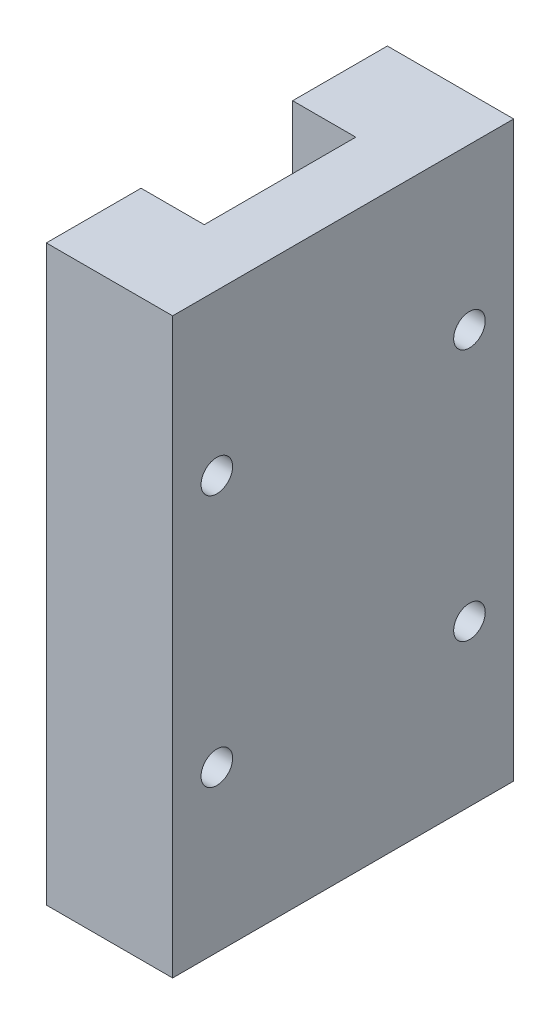
ISO-10303-21;
HEADER;
FILE_DESCRIPTION(('STEP AP214'),'2;1');
FILE_NAME('part.step','',(''),(''),'','','');
FILE_SCHEMA(('AUTOMOTIVE_DESIGN { 1 0 10303 214 1 1 1 1 }'));
ENDSEC;
DATA;
#1=APPLICATION_CONTEXT('core data for automotive mechanical design processes');
#2=APPLICATION_PROTOCOL_DEFINITION('international standard','automotive_design',2000,#1);
#3=PRODUCT_CONTEXT('',#1,'mechanical');
#4=PRODUCT('Part','Part','',(#3));
#5=PRODUCT_RELATED_PRODUCT_CATEGORY('part','',(#4));
#6=PRODUCT_DEFINITION_FORMATION('','',#4);
#7=PRODUCT_DEFINITION_CONTEXT('part definition',#1,'design');
#8=PRODUCT_DEFINITION('design','',#6,#7);
#9=PRODUCT_DEFINITION_SHAPE('','',#8);
#10=(LENGTH_UNIT() NAMED_UNIT(*) SI_UNIT(.MILLI.,.METRE.));
#11=(NAMED_UNIT(*) PLANE_ANGLE_UNIT() SI_UNIT($,.RADIAN.));
#12=(NAMED_UNIT(*) SI_UNIT($,.STERADIAN.) SOLID_ANGLE_UNIT());
#13=UNCERTAINTY_MEASURE_WITH_UNIT(LENGTH_MEASURE(1.E-05),#10,'distance_accuracy_value','');
#14=(GEOMETRIC_REPRESENTATION_CONTEXT(3) GLOBAL_UNCERTAINTY_ASSIGNED_CONTEXT((#13)) GLOBAL_UNIT_ASSIGNED_CONTEXT((#10,
#11,#12)) REPRESENTATION_CONTEXT('',''));
#15=CARTESIAN_POINT('',(0.,0.,0.));
#16=DIRECTION('',(0.,0.,1.));
#17=DIRECTION('',(1.,0.,0.));
#18=AXIS2_PLACEMENT_3D('',#15,#16,#17);
#19=CARTESIAN_POINT('',(0.,22.7,13.5));
#20=DIRECTION('',(-1.,0.,0.));
#21=DIRECTION('',(0.,0.,1.));
#22=AXIS2_PLACEMENT_3D('',#19,#20,#21);
#23=PLANE('',#22);
#24=DIRECTION('',(0.,-1.,0.));
#25=VECTOR('',#24,1.);
#26=CARTESIAN_POINT('',(0.,22.7,6.));
#27=LINE('',#26,#25);
#28=CARTESIAN_POINT('',(0.,22.7,6.));
#29=VERTEX_POINT('',#28);
#30=CARTESIAN_POINT('',(0.,-22.7,6.));
#31=VERTEX_POINT('',#30);
#32=EDGE_CURVE('E164',#29,#31,#27,.T.);
#33=ORIENTED_EDGE('',*,*,#32,.T.);
#34=DIRECTION('',(0.,0.,-1.));
#35=VECTOR('',#34,1.);
#36=CARTESIAN_POINT('',(0.,-22.7,13.5));
#37=LINE('',#36,#35);
#38=CARTESIAN_POINT('',(0.,-22.7,13.5));
#39=VERTEX_POINT('',#38);
#40=EDGE_CURVE('E184',#39,#31,#37,.T.);
#41=ORIENTED_EDGE('',*,*,#40,.F.);
#42=DIRECTION('',(0.,-1.,0.));
#43=VECTOR('',#42,1.);
#44=CARTESIAN_POINT('',(0.,-22.7,13.5));
#45=LINE('',#44,#43);
#46=CARTESIAN_POINT('',(0.,22.7,13.5));
#47=VERTEX_POINT('',#46);
#48=EDGE_CURVE('E167',#47,#39,#45,.T.);
#49=ORIENTED_EDGE('',*,*,#48,.F.);
#50=DIRECTION('',(0.,0.,1.));
#51=VECTOR('',#50,1.);
#52=CARTESIAN_POINT('',(0.,22.7,13.5));
#53=LINE('',#52,#51);
#54=EDGE_CURVE('E78',#29,#47,#53,.T.);
#55=ORIENTED_EDGE('',*,*,#54,.F.);
#56=EDGE_LOOP('',(#33,#41,#49,#55));
#57=FACE_BOUND('',#56,.T.);
#58=ADVANCED_FACE('F33',(#57),#23,.T.);
#59=CARTESIAN_POINT('',(10.,-22.7,13.5));
#60=DIRECTION('',(0.,0.,-1.));
#61=DIRECTION('',(0.,1.,0.));
#62=AXIS2_PLACEMENT_3D('',#59,#60,#61);
#63=PLANE('',#62);
#64=ORIENTED_EDGE('',*,*,#48,.T.);
#65=DIRECTION('',(-1.,0.,0.));
#66=VECTOR('',#65,1.);
#67=CARTESIAN_POINT('',(10.,-22.7,13.5));
#68=LINE('',#67,#66);
#69=CARTESIAN_POINT('',(10.,-22.7,13.5));
#70=VERTEX_POINT('',#69);
#71=EDGE_CURVE('E11',#70,#39,#68,.T.);
#72=ORIENTED_EDGE('',*,*,#71,.F.);
#73=DIRECTION('',(0.,-1.,0.));
#74=VECTOR('',#73,1.);
#75=CARTESIAN_POINT('',(10.,-22.7,13.5));
#76=LINE('',#75,#74);
#77=CARTESIAN_POINT('',(10.,22.7,13.5));
#78=VERTEX_POINT('',#77);
#79=EDGE_CURVE('E173',#78,#70,#76,.T.);
#80=ORIENTED_EDGE('',*,*,#79,.F.);
#81=DIRECTION('',(-1.,0.,0.));
#82=VECTOR('',#81,1.);
#83=CARTESIAN_POINT('',(10.,22.7,13.5));
#84=LINE('',#83,#82);
#85=EDGE_CURVE('E180',#78,#47,#84,.T.);
#86=ORIENTED_EDGE('',*,*,#85,.T.);
#87=EDGE_LOOP('',(#64,#72,#80,#86));
#88=FACE_BOUND('',#87,.T.);
#89=ADVANCED_FACE('F35',(#88),#63,.F.);
#90=CARTESIAN_POINT('',(10.,-22.7,13.5));
#91=DIRECTION('',(0.,1.,0.));
#92=DIRECTION('',(0.,0.,1.));
#93=AXIS2_PLACEMENT_3D('',#90,#91,#92);
#94=PLANE('',#93);
#95=ORIENTED_EDGE('',*,*,#40,.T.);
#96=DIRECTION('',(-1.,0.,0.));
#97=VECTOR('',#96,1.);
#98=CARTESIAN_POINT('',(0.,-22.7,6.));
#99=LINE('',#98,#97);
#100=CARTESIAN_POINT('',(5.,-22.7,6.));
#101=VERTEX_POINT('',#100);
#102=EDGE_CURVE('E152',#101,#31,#99,.T.);
#103=ORIENTED_EDGE('',*,*,#102,.F.);
#104=DIRECTION('',(0.,0.,1.));
#105=VECTOR('',#104,1.);
#106=CARTESIAN_POINT('',(5.,-22.7,6.));
#107=LINE('',#106,#105);
#108=CARTESIAN_POINT('',(5.,-22.7,-6.));
#109=VERTEX_POINT('',#108);
#110=EDGE_CURVE('E160',#109,#101,#107,.T.);
#111=ORIENTED_EDGE('',*,*,#110,.F.);
#112=DIRECTION('',(1.,0.,0.));
#113=VECTOR('',#112,1.);
#114=CARTESIAN_POINT('',(0.,-22.7,-6.));
#115=LINE('',#114,#113);
#116=CARTESIAN_POINT('',(0.,-22.7,-6.));
#117=VERTEX_POINT('',#116);
#118=EDGE_CURVE('E149',#117,#109,#115,.T.);
#119=ORIENTED_EDGE('',*,*,#118,.F.);
#120=CARTESIAN_POINT('',(0.,-22.7,-13.5));
#121=VERTEX_POINT('',#120);
#122=EDGE_CURVE('E183',#117,#121,#37,.T.);
#123=ORIENTED_EDGE('',*,*,#122,.T.);
#124=DIRECTION('',(-1.,0.,0.));
#125=VECTOR('',#124,1.);
#126=CARTESIAN_POINT('',(10.,-22.7,-13.5));
#127=LINE('',#126,#125);
#128=CARTESIAN_POINT('',(10.,-22.7,-13.5));
#129=VERTEX_POINT('',#128);
#130=EDGE_CURVE('E41',#129,#121,#127,.T.);
#131=ORIENTED_EDGE('',*,*,#130,.F.);
#132=DIRECTION('',(0.,0.,-1.));
#133=VECTOR('',#132,1.);
#134=CARTESIAN_POINT('',(10.,-22.7,13.5));
#135=LINE('',#134,#133);
#136=EDGE_CURVE('E85',#70,#129,#135,.T.);
#137=ORIENTED_EDGE('',*,*,#136,.F.);
#138=ORIENTED_EDGE('',*,*,#71,.T.);
#139=EDGE_LOOP('',(#95,#103,#111,#119,#123,#131,#137,#138));
#140=FACE_BOUND('',#139,.T.);
#141=ADVANCED_FACE('F228',(#140),#94,.F.);
#142=CARTESIAN_POINT('',(10.,-22.7,-13.5));
#143=DIRECTION('',(0.,0.,1.));
#144=DIRECTION('',(1.,0.,0.));
#145=AXIS2_PLACEMENT_3D('',#142,#143,#144);
#146=PLANE('',#145);
#147=DIRECTION('',(0.,1.,0.));
#148=VECTOR('',#147,1.);
#149=CARTESIAN_POINT('',(0.,-22.7,-13.5));
#150=LINE('',#149,#148);
#151=CARTESIAN_POINT('',(0.,22.7,-13.5));
#152=VERTEX_POINT('',#151);
#153=EDGE_CURVE('E187',#121,#152,#150,.T.);
#154=ORIENTED_EDGE('',*,*,#153,.T.);
#155=DIRECTION('',(-1.,0.,0.));
#156=VECTOR('',#155,1.);
#157=CARTESIAN_POINT('',(10.,22.7,-13.5));
#158=LINE('',#157,#156);
#159=CARTESIAN_POINT('',(10.,22.7,-13.5));
#160=VERTEX_POINT('',#159);
#161=EDGE_CURVE('E192',#160,#152,#158,.T.);
#162=ORIENTED_EDGE('',*,*,#161,.F.);
#163=DIRECTION('',(0.,1.,0.));
#164=VECTOR('',#163,1.);
#165=CARTESIAN_POINT('',(10.,-22.7,-13.5));
#166=LINE('',#165,#164);
#167=EDGE_CURVE('E177',#129,#160,#166,.T.);
#168=ORIENTED_EDGE('',*,*,#167,.F.);
#169=ORIENTED_EDGE('',*,*,#130,.T.);
#170=EDGE_LOOP('',(#154,#162,#168,#169));
#171=FACE_BOUND('',#170,.T.);
#172=ADVANCED_FACE('F198',(#171),#146,.F.);
#173=CARTESIAN_POINT('',(10.,22.7,13.5));
#174=DIRECTION('',(0.,-1.,0.));
#175=DIRECTION('',(0.,0.,-1.));
#176=AXIS2_PLACEMENT_3D('',#173,#174,#175);
#177=PLANE('',#176);
#178=DIRECTION('',(0.,0.,1.));
#179=VECTOR('',#178,1.);
#180=CARTESIAN_POINT('',(5.,22.7,6.));
#181=LINE('',#180,#179);
#182=CARTESIAN_POINT('',(5.,22.7,-6.));
#183=VERTEX_POINT('',#182);
#184=CARTESIAN_POINT('',(5.,22.7,6.));
#185=VERTEX_POINT('',#184);
#186=EDGE_CURVE('E151',#183,#185,#181,.T.);
#187=ORIENTED_EDGE('',*,*,#186,.T.);
#188=DIRECTION('',(-1.,0.,0.));
#189=VECTOR('',#188,1.);
#190=CARTESIAN_POINT('',(0.,22.7,6.));
#191=LINE('',#190,#189);
#192=EDGE_CURVE('E155',#185,#29,#191,.T.);
#193=ORIENTED_EDGE('',*,*,#192,.T.);
#194=ORIENTED_EDGE('',*,*,#54,.T.);
#195=ORIENTED_EDGE('',*,*,#85,.F.);
#196=DIRECTION('',(0.,0.,1.));
#197=VECTOR('',#196,1.);
#198=CARTESIAN_POINT('',(10.,22.7,13.5));
#199=LINE('',#198,#197);
#200=EDGE_CURVE('E57',#160,#78,#199,.T.);
#201=ORIENTED_EDGE('',*,*,#200,.F.);
#202=ORIENTED_EDGE('',*,*,#161,.T.);
#203=CARTESIAN_POINT('',(0.,22.7,-6.));
#204=VERTEX_POINT('',#203);
#205=EDGE_CURVE('E175',#152,#204,#53,.T.);
#206=ORIENTED_EDGE('',*,*,#205,.T.);
#207=DIRECTION('',(1.,0.,0.));
#208=VECTOR('',#207,1.);
#209=CARTESIAN_POINT('',(0.,22.7,-6.));
#210=LINE('',#209,#208);
#211=EDGE_CURVE('E48',#204,#183,#210,.T.);
#212=ORIENTED_EDGE('',*,*,#211,.T.);
#213=EDGE_LOOP('',(#187,#193,#194,#195,#201,#202,#206,#212));
#214=FACE_BOUND('',#213,.T.);
#215=ADVANCED_FACE('F204',(#214),#177,.F.);
#216=CARTESIAN_POINT('',(10.,22.7,13.5));
#217=DIRECTION('',(-1.,0.,0.));
#218=DIRECTION('',(0.,0.,1.));
#219=AXIS2_PLACEMENT_3D('',#216,#217,#218);
#220=PLANE('',#219);
#221=CARTESIAN_POINT('',(10.,10.,-10.));
#222=DIRECTION('',(1.,0.,0.));
#223=DIRECTION('',(0.,0.,-1.));
#224=AXIS2_PLACEMENT_3D('',#221,#222,#223);
#225=CIRCLE('',#224,1.25);
#226=CARTESIAN_POINT('',(10.,10.,-11.25));
#227=VERTEX_POINT('',#226);
#228=EDGE_CURVE('E126',#227,#227,#225,.T.);
#229=ORIENTED_EDGE('',*,*,#228,.F.);
#230=EDGE_LOOP('',(#229));
#231=FACE_BOUND('',#230,.T.);
#232=CARTESIAN_POINT('',(10.,-10.,-10.));
#233=DIRECTION('',(1.,0.,0.));
#234=DIRECTION('',(0.,0.,-1.));
#235=AXIS2_PLACEMENT_3D('',#232,#233,#234);
#236=CIRCLE('',#235,1.25);
#237=CARTESIAN_POINT('',(10.,-10.,-11.25));
#238=VERTEX_POINT('',#237);
#239=EDGE_CURVE('E134',#238,#238,#236,.T.);
#240=ORIENTED_EDGE('',*,*,#239,.F.);
#241=EDGE_LOOP('',(#240));
#242=FACE_BOUND('',#241,.T.);
#243=CARTESIAN_POINT('',(10.,10.,10.));
#244=DIRECTION('',(1.,0.,0.));
#245=DIRECTION('',(0.,0.,-1.));
#246=AXIS2_PLACEMENT_3D('',#243,#244,#245);
#247=CIRCLE('',#246,1.25);
#248=CARTESIAN_POINT('',(10.,10.,8.75));
#249=VERTEX_POINT('',#248);
#250=EDGE_CURVE('E140',#249,#249,#247,.T.);
#251=ORIENTED_EDGE('',*,*,#250,.F.);
#252=EDGE_LOOP('',(#251));
#253=FACE_BOUND('',#252,.T.);
#254=CARTESIAN_POINT('',(10.,-10.,10.));
#255=DIRECTION('',(1.,0.,0.));
#256=DIRECTION('',(0.,0.,-1.));
#257=AXIS2_PLACEMENT_3D('',#254,#255,#256);
#258=CIRCLE('',#257,1.25);
#259=CARTESIAN_POINT('',(10.,-10.,8.75));
#260=VERTEX_POINT('',#259);
#261=EDGE_CURVE('E146',#260,#260,#258,.T.);
#262=ORIENTED_EDGE('',*,*,#261,.F.);
#263=EDGE_LOOP('',(#262));
#264=FACE_BOUND('',#263,.T.);
#265=ORIENTED_EDGE('',*,*,#79,.T.);
#266=ORIENTED_EDGE('',*,*,#136,.T.);
#267=ORIENTED_EDGE('',*,*,#167,.T.);
#268=ORIENTED_EDGE('',*,*,#200,.T.);
#269=EDGE_LOOP('',(#265,#266,#267,#268));
#270=FACE_BOUND('',#269,.T.);
#271=ADVANCED_FACE('F209',(#231,#242,#253,#264,#270),#220,.F.);
#272=DIRECTION('',(0.,-1.,0.));
#273=VECTOR('',#272,1.);
#274=CARTESIAN_POINT('',(0.,22.7,-6.));
#275=LINE('',#274,#273);
#276=EDGE_CURVE('E157',#204,#117,#275,.T.);
#277=ORIENTED_EDGE('',*,*,#276,.F.);
#278=ORIENTED_EDGE('',*,*,#205,.F.);
#279=ORIENTED_EDGE('',*,*,#153,.F.);
#280=ORIENTED_EDGE('',*,*,#122,.F.);
#281=EDGE_LOOP('',(#277,#278,#279,#280));
#282=FACE_BOUND('',#281,.T.);
#283=ADVANCED_FACE('F203',(#282),#23,.T.);
#284=CARTESIAN_POINT('',(0.,22.7,6.));
#285=DIRECTION('',(0.,0.,1.));
#286=DIRECTION('',(1.,0.,0.));
#287=AXIS2_PLACEMENT_3D('',#284,#285,#286);
#288=PLANE('',#287);
#289=ORIENTED_EDGE('',*,*,#102,.T.);
#290=ORIENTED_EDGE('',*,*,#32,.F.);
#291=ORIENTED_EDGE('',*,*,#192,.F.);
#292=DIRECTION('',(0.,-1.,0.));
#293=VECTOR('',#292,1.);
#294=CARTESIAN_POINT('',(5.,22.7,6.));
#295=LINE('',#294,#293);
#296=EDGE_CURVE('E168',#185,#101,#295,.T.);
#297=ORIENTED_EDGE('',*,*,#296,.T.);
#298=EDGE_LOOP('',(#289,#290,#291,#297));
#299=FACE_BOUND('',#298,.T.);
#300=ADVANCED_FACE('F217',(#299),#288,.F.);
#301=CARTESIAN_POINT('',(5.,22.7,6.));
#302=DIRECTION('',(1.,0.,0.));
#303=DIRECTION('',(0.,0.,-1.));
#304=AXIS2_PLACEMENT_3D('',#301,#302,#303);
#305=PLANE('',#304);
#306=ORIENTED_EDGE('',*,*,#110,.T.);
#307=ORIENTED_EDGE('',*,*,#296,.F.);
#308=ORIENTED_EDGE('',*,*,#186,.F.);
#309=DIRECTION('',(0.,-1.,0.));
#310=VECTOR('',#309,1.);
#311=CARTESIAN_POINT('',(5.,22.7,-6.));
#312=LINE('',#311,#310);
#313=EDGE_CURVE('E170',#183,#109,#312,.T.);
#314=ORIENTED_EDGE('',*,*,#313,.T.);
#315=EDGE_LOOP('',(#306,#307,#308,#314));
#316=FACE_BOUND('',#315,.T.);
#317=ADVANCED_FACE('F240',(#316),#305,.F.);
#318=CARTESIAN_POINT('',(0.,22.7,-6.));
#319=DIRECTION('',(0.,0.,-1.));
#320=DIRECTION('',(-1.,0.,0.));
#321=AXIS2_PLACEMENT_3D('',#318,#319,#320);
#322=PLANE('',#321);
#323=ORIENTED_EDGE('',*,*,#118,.T.);
#324=ORIENTED_EDGE('',*,*,#313,.F.);
#325=ORIENTED_EDGE('',*,*,#211,.F.);
#326=ORIENTED_EDGE('',*,*,#276,.T.);
#327=EDGE_LOOP('',(#323,#324,#325,#326));
#328=FACE_BOUND('',#327,.T.);
#329=ADVANCED_FACE('F242',(#328),#322,.F.);
#330=CARTESIAN_POINT('',(10.,-10.,10.));
#331=DIRECTION('',(1.,0.,0.));
#332=DIRECTION('',(0.,0.,-1.));
#333=AXIS2_PLACEMENT_3D('',#330,#331,#332);
#334=CYLINDRICAL_SURFACE('',#333,1.25);
#335=CARTESIAN_POINT('',(5.5,-10.,10.));
#336=DIRECTION('',(1.,0.,0.));
#337=DIRECTION('',(0.,0.,-1.));
#338=AXIS2_PLACEMENT_3D('',#335,#336,#337);
#339=CIRCLE('',#338,1.25);
#340=CARTESIAN_POINT('',(5.5,-10.,8.75));
#341=VERTEX_POINT('',#340);
#342=EDGE_CURVE('E143',#341,#341,#339,.T.);
#343=ORIENTED_EDGE('',*,*,#342,.F.);
#344=EDGE_LOOP('',(#343));
#345=FACE_BOUND('',#344,.T.);
#346=ORIENTED_EDGE('',*,*,#261,.T.);
#347=EDGE_LOOP('',(#346));
#348=FACE_BOUND('',#347,.T.);
#349=ADVANCED_FACE('F244',(#345,#348),#334,.F.);
#350=CARTESIAN_POINT('',(5.5,-10.,10.));
#351=DIRECTION('',(1.,0.,0.));
#352=DIRECTION('',(0.,0.,-1.));
#353=AXIS2_PLACEMENT_3D('',#350,#351,#352);
#354=CONICAL_SURFACE('',#353,1.25,1.02974425867665);
#355=CARTESIAN_POINT('',(4.74892422621555,-10.,10.));
#356=VERTEX_POINT('',#355);
#357=VERTEX_LOOP('',#356);
#358=FACE_BOUND('',#357,.T.);
#359=ORIENTED_EDGE('',*,*,#342,.T.);
#360=EDGE_LOOP('',(#359));
#361=FACE_BOUND('',#360,.T.);
#362=ADVANCED_FACE('F249',(#358,#361),#354,.F.);
#363=CARTESIAN_POINT('',(10.,10.,10.));
#364=DIRECTION('',(1.,0.,0.));
#365=DIRECTION('',(0.,0.,-1.));
#366=AXIS2_PLACEMENT_3D('',#363,#364,#365);
#367=CYLINDRICAL_SURFACE('',#366,1.25);
#368=CARTESIAN_POINT('',(5.5,10.,10.));
#369=DIRECTION('',(1.,0.,0.));
#370=DIRECTION('',(0.,0.,-1.));
#371=AXIS2_PLACEMENT_3D('',#368,#369,#370);
#372=CIRCLE('',#371,1.25);
#373=CARTESIAN_POINT('',(5.5,10.,8.75));
#374=VERTEX_POINT('',#373);
#375=EDGE_CURVE('E137',#374,#374,#372,.T.);
#376=ORIENTED_EDGE('',*,*,#375,.F.);
#377=EDGE_LOOP('',(#376));
#378=FACE_BOUND('',#377,.T.);
#379=ORIENTED_EDGE('',*,*,#250,.T.);
#380=EDGE_LOOP('',(#379));
#381=FACE_BOUND('',#380,.T.);
#382=ADVANCED_FACE('F258',(#378,#381),#367,.F.);
#383=CARTESIAN_POINT('',(5.5,10.,10.));
#384=DIRECTION('',(1.,0.,0.));
#385=DIRECTION('',(0.,0.,-1.));
#386=AXIS2_PLACEMENT_3D('',#383,#384,#385);
#387=CONICAL_SURFACE('',#386,1.25,1.02974425867665);
#388=CARTESIAN_POINT('',(4.74892422621555,10.,10.));
#389=VERTEX_POINT('',#388);
#390=VERTEX_LOOP('',#389);
#391=FACE_BOUND('',#390,.T.);
#392=ORIENTED_EDGE('',*,*,#375,.T.);
#393=EDGE_LOOP('',(#392));
#394=FACE_BOUND('',#393,.T.);
#395=ADVANCED_FACE('F262',(#391,#394),#387,.F.);
#396=CARTESIAN_POINT('',(10.,-10.,-10.));
#397=DIRECTION('',(1.,0.,0.));
#398=DIRECTION('',(0.,0.,-1.));
#399=AXIS2_PLACEMENT_3D('',#396,#397,#398);
#400=CYLINDRICAL_SURFACE('',#399,1.25);
#401=CARTESIAN_POINT('',(5.5,-10.,-10.));
#402=DIRECTION('',(1.,0.,0.));
#403=DIRECTION('',(0.,0.,-1.));
#404=AXIS2_PLACEMENT_3D('',#401,#402,#403);
#405=CIRCLE('',#404,1.25);
#406=CARTESIAN_POINT('',(5.5,-10.,-11.25));
#407=VERTEX_POINT('',#406);
#408=EDGE_CURVE('E129',#407,#407,#405,.T.);
#409=ORIENTED_EDGE('',*,*,#408,.F.);
#410=EDGE_LOOP('',(#409));
#411=FACE_BOUND('',#410,.T.);
#412=ORIENTED_EDGE('',*,*,#239,.T.);
#413=EDGE_LOOP('',(#412));
#414=FACE_BOUND('',#413,.T.);
#415=ADVANCED_FACE('F266',(#411,#414),#400,.F.);
#416=CARTESIAN_POINT('',(5.5,-10.,-10.));
#417=DIRECTION('',(1.,0.,0.));
#418=DIRECTION('',(0.,0.,-1.));
#419=AXIS2_PLACEMENT_3D('',#416,#417,#418);
#420=CONICAL_SURFACE('',#419,1.25,1.02974425867665);
#421=CARTESIAN_POINT('',(4.74892422621555,-10.,-10.));
#422=VERTEX_POINT('',#421);
#423=VERTEX_LOOP('',#422);
#424=FACE_BOUND('',#423,.T.);
#425=ORIENTED_EDGE('',*,*,#408,.T.);
#426=EDGE_LOOP('',(#425));
#427=FACE_BOUND('',#426,.T.);
#428=ADVANCED_FACE('F270',(#424,#427),#420,.F.);
#429=CARTESIAN_POINT('',(10.,10.,-10.));
#430=DIRECTION('',(1.,0.,0.));
#431=DIRECTION('',(0.,0.,-1.));
#432=AXIS2_PLACEMENT_3D('',#429,#430,#431);
#433=CYLINDRICAL_SURFACE('',#432,1.25);
#434=CARTESIAN_POINT('',(5.5,10.,-10.));
#435=DIRECTION('',(1.,0.,0.));
#436=DIRECTION('',(0.,0.,-1.));
#437=AXIS2_PLACEMENT_3D('',#434,#435,#436);
#438=CIRCLE('',#437,1.25);
#439=CARTESIAN_POINT('',(5.5,10.,-11.25));
#440=VERTEX_POINT('',#439);
#441=EDGE_CURVE('E124',#440,#440,#438,.T.);
#442=ORIENTED_EDGE('',*,*,#441,.F.);
#443=EDGE_LOOP('',(#442));
#444=FACE_BOUND('',#443,.T.);
#445=ORIENTED_EDGE('',*,*,#228,.T.);
#446=EDGE_LOOP('',(#445));
#447=FACE_BOUND('',#446,.T.);
#448=ADVANCED_FACE('F120',(#444,#447),#433,.F.);
#449=CARTESIAN_POINT('',(5.5,10.,-10.));
#450=DIRECTION('',(1.,0.,0.));
#451=DIRECTION('',(0.,0.,-1.));
#452=AXIS2_PLACEMENT_3D('',#449,#450,#451);
#453=CONICAL_SURFACE('',#452,1.25,1.02974425867665);
#454=CARTESIAN_POINT('',(4.74892422621555,10.,-10.));
#455=VERTEX_POINT('',#454);
#456=VERTEX_LOOP('',#455);
#457=FACE_BOUND('',#456,.T.);
#458=ORIENTED_EDGE('',*,*,#441,.T.);
#459=EDGE_LOOP('',(#458));
#460=FACE_BOUND('',#459,.T.);
#461=ADVANCED_FACE('F117',(#457,#460),#453,.F.);
#462=CLOSED_SHELL('',(#58,#89,#141,#172,#215,#271,#283,#300,#317,#329,#349,#362,#382,#395,#415,
#428,#448,#461));
#463=MANIFOLD_SOLID_BREP('B2',#462);
#464=ADVANCED_BREP_SHAPE_REPRESENTATION('',(#18,#463),#14);
#465=SHAPE_DEFINITION_REPRESENTATION(#9,#464);
ENDSEC;
END-ISO-10303-21;
